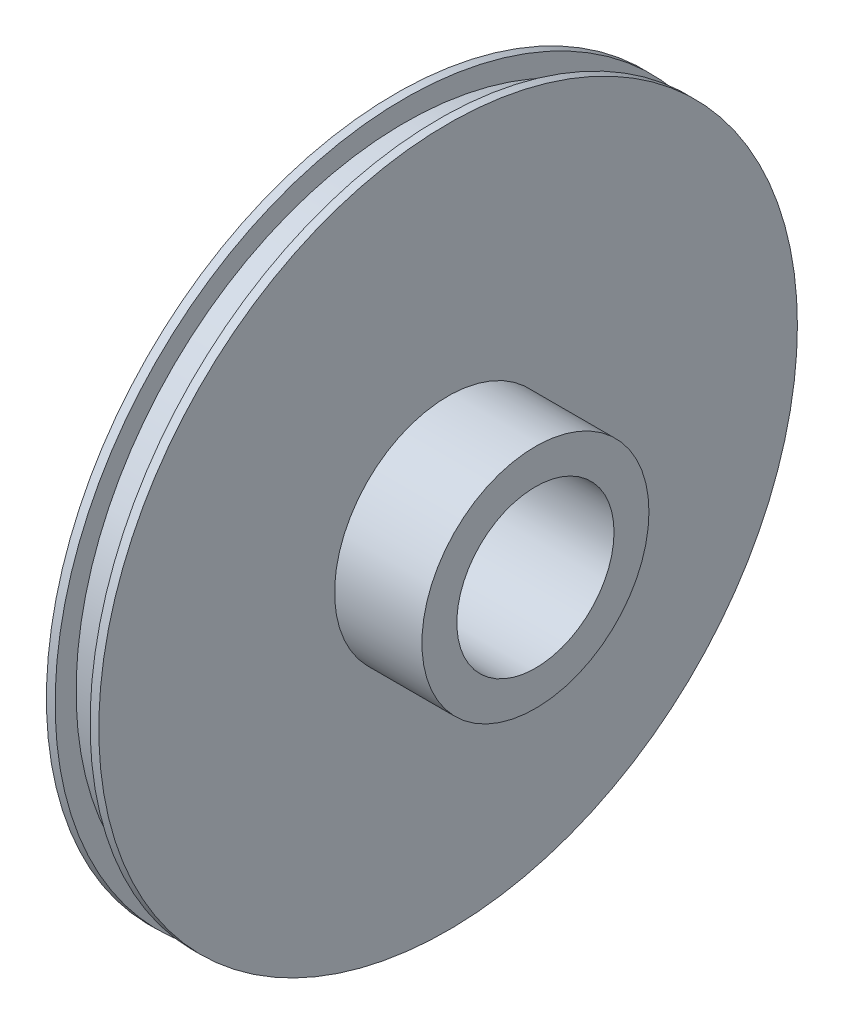
ISO-10303-21;
HEADER;
FILE_DESCRIPTION(('STEP AP214'),'2;1');
FILE_NAME('part.step','',(''),(''),'','','');
FILE_SCHEMA(('AUTOMOTIVE_DESIGN { 1 0 10303 214 1 1 1 1 }'));
ENDSEC;
DATA;
#1=APPLICATION_CONTEXT('core data for automotive mechanical design processes');
#2=APPLICATION_PROTOCOL_DEFINITION('international standard','automotive_design',2000,#1);
#3=PRODUCT_CONTEXT('',#1,'mechanical');
#4=PRODUCT('Part','Part','',(#3));
#5=PRODUCT_RELATED_PRODUCT_CATEGORY('part','',(#4));
#6=PRODUCT_DEFINITION_FORMATION('','',#4);
#7=PRODUCT_DEFINITION_CONTEXT('part definition',#1,'design');
#8=PRODUCT_DEFINITION('design','',#6,#7);
#9=PRODUCT_DEFINITION_SHAPE('','',#8);
#10=(LENGTH_UNIT() NAMED_UNIT(*) SI_UNIT(.MILLI.,.METRE.));
#11=(NAMED_UNIT(*) PLANE_ANGLE_UNIT() SI_UNIT($,.RADIAN.));
#12=(NAMED_UNIT(*) SI_UNIT($,.STERADIAN.) SOLID_ANGLE_UNIT());
#13=UNCERTAINTY_MEASURE_WITH_UNIT(LENGTH_MEASURE(1.E-05),#10,'distance_accuracy_value','');
#14=(GEOMETRIC_REPRESENTATION_CONTEXT(3) GLOBAL_UNCERTAINTY_ASSIGNED_CONTEXT((#13)) GLOBAL_UNIT_ASSIGNED_CONTEXT((#10,
#11,#12)) REPRESENTATION_CONTEXT('',''));
#15=CARTESIAN_POINT('',(0.,0.,0.));
#16=DIRECTION('',(0.,0.,1.));
#17=DIRECTION('',(1.,0.,0.));
#18=AXIS2_PLACEMENT_3D('',#15,#16,#17);
#19=CARTESIAN_POINT('',(-1.5,0.,0.));
#20=DIRECTION('',(1.,0.,0.));
#21=DIRECTION('',(0.,0.,-1.));
#22=AXIS2_PLACEMENT_3D('',#19,#20,#21);
#23=PLANE('',#22);
#24=CARTESIAN_POINT('',(-1.50000000000007,0.,0.));
#25=DIRECTION('',(-1.,0.,0.));
#26=DIRECTION('',(0.,0.,1.));
#27=AXIS2_PLACEMENT_3D('',#24,#25,#26);
#28=CIRCLE('',#27,15.4999999999999);
#29=CARTESIAN_POINT('',(-1.50000000000007,0.,15.4999999999999));
#30=VERTEX_POINT('',#29);
#31=EDGE_CURVE('E52',#30,#30,#28,.F.);
#32=ORIENTED_EDGE('',*,*,#31,.T.);
#33=EDGE_LOOP('',(#32));
#34=FACE_BOUND('',#33,.T.);
#35=CARTESIAN_POINT('',(-1.5,0.,0.));
#36=DIRECTION('',(1.,0.,0.));
#37=DIRECTION('',(0.,0.,-1.));
#38=AXIS2_PLACEMENT_3D('',#35,#36,#37);
#39=CIRCLE('',#38,20.);
#40=CARTESIAN_POINT('',(-1.5,0.,-20.));
#41=VERTEX_POINT('',#40);
#42=EDGE_CURVE('E18',#41,#41,#39,.T.);
#43=ORIENTED_EDGE('',*,*,#42,.F.);
#44=EDGE_LOOP('',(#43));
#45=FACE_BOUND('',#44,.T.);
#46=ADVANCED_FACE('F14',(#34,#45),#23,.F.);
#47=CARTESIAN_POINT('',(-1.9,0.,0.));
#48=DIRECTION('',(1.,0.,0.));
#49=DIRECTION('',(0.,0.,-1.));
#50=AXIS2_PLACEMENT_3D('',#47,#48,#49);
#51=CYLINDRICAL_SURFACE('',#50,20.);
#52=CARTESIAN_POINT('',(-1.,0.,0.));
#53=DIRECTION('',(1.,0.,0.));
#54=DIRECTION('',(0.,0.,-1.));
#55=AXIS2_PLACEMENT_3D('',#52,#53,#54);
#56=CIRCLE('',#55,20.);
#57=CARTESIAN_POINT('',(-1.,0.,-20.));
#58=VERTEX_POINT('',#57);
#59=EDGE_CURVE('E50',#58,#58,#56,.T.);
#60=ORIENTED_EDGE('',*,*,#59,.F.);
#61=EDGE_LOOP('',(#60));
#62=FACE_BOUND('',#61,.T.);
#63=ORIENTED_EDGE('',*,*,#42,.T.);
#64=EDGE_LOOP('',(#63));
#65=FACE_BOUND('',#64,.T.);
#66=ADVANCED_FACE('F59',(#62,#65),#51,.T.);
#67=CARTESIAN_POINT('',(-1.50000000000007,0.,0.));
#68=DIRECTION('',(-1.,0.,0.));
#69=DIRECTION('',(0.,0.,1.));
#70=AXIS2_PLACEMENT_3D('',#67,#68,#69);
#71=CONICAL_SURFACE('',#70,15.4999999999999,0.7853981633973);
#72=ORIENTED_EDGE('',*,*,#31,.F.);
#73=EDGE_LOOP('',(#72));
#74=FACE_BOUND('',#73,.T.);
#75=CARTESIAN_POINT('',(-0.499999999999928,0.,0.));
#76=DIRECTION('',(-1.,0.,0.));
#77=DIRECTION('',(0.,0.,1.));
#78=AXIS2_PLACEMENT_3D('',#75,#76,#77);
#79=CIRCLE('',#78,14.5000000000001);
#80=CARTESIAN_POINT('',(-0.499999999999928,0.,14.5000000000001));
#81=VERTEX_POINT('',#80);
#82=EDGE_CURVE('E47',#81,#81,#79,.F.);
#83=ORIENTED_EDGE('',*,*,#82,.T.);
#84=EDGE_LOOP('',(#83));
#85=FACE_BOUND('',#84,.T.);
#86=ADVANCED_FACE('F68',(#74,#85),#71,.F.);
#87=CARTESIAN_POINT('',(-1.,0.,0.));
#88=DIRECTION('',(1.,0.,0.));
#89=DIRECTION('',(0.,0.,-1.));
#90=AXIS2_PLACEMENT_3D('',#87,#88,#89);
#91=PLANE('',#90);
#92=CARTESIAN_POINT('',(-1.,0.,0.));
#93=DIRECTION('',(1.,0.,0.));
#94=DIRECTION('',(0.,0.,-1.));
#95=AXIS2_PLACEMENT_3D('',#92,#93,#94);
#96=CIRCLE('',#95,18.8);
#97=CARTESIAN_POINT('',(-1.,0.,-18.8));
#98=VERTEX_POINT('',#97);
#99=EDGE_CURVE('E44',#98,#98,#96,.T.);
#100=ORIENTED_EDGE('',*,*,#99,.F.);
#101=EDGE_LOOP('',(#100));
#102=FACE_BOUND('',#101,.T.);
#103=ORIENTED_EDGE('',*,*,#59,.T.);
#104=EDGE_LOOP('',(#103));
#105=FACE_BOUND('',#104,.T.);
#106=ADVANCED_FACE('F111',(#102,#105),#91,.T.);
#107=CARTESIAN_POINT('',(-0.5,0.,0.));
#108=DIRECTION('',(1.,0.,0.));
#109=DIRECTION('',(0.,0.,-1.));
#110=AXIS2_PLACEMENT_3D('',#107,#108,#109);
#111=PLANE('',#110);
#112=CARTESIAN_POINT('',(-0.5,0.,0.));
#113=DIRECTION('',(1.,0.,0.));
#114=DIRECTION('',(0.,0.,-1.));
#115=AXIS2_PLACEMENT_3D('',#112,#113,#114);
#116=CIRCLE('',#115,4.5);
#117=CARTESIAN_POINT('',(-0.5,0.,-4.5));
#118=VERTEX_POINT('',#117);
#119=EDGE_CURVE('E41',#118,#118,#116,.T.);
#120=ORIENTED_EDGE('',*,*,#119,.T.);
#121=EDGE_LOOP('',(#120));
#122=FACE_BOUND('',#121,.T.);
#123=ORIENTED_EDGE('',*,*,#82,.F.);
#124=EDGE_LOOP('',(#123));
#125=FACE_BOUND('',#124,.T.);
#126=ADVANCED_FACE('F107',(#122,#125),#111,.F.);
#127=CARTESIAN_POINT('',(-1.9,0.,0.));
#128=DIRECTION('',(1.,0.,0.));
#129=DIRECTION('',(0.,0.,-1.));
#130=AXIS2_PLACEMENT_3D('',#127,#128,#129);
#131=CYLINDRICAL_SURFACE('',#130,18.8);
#132=ORIENTED_EDGE('',*,*,#99,.T.);
#133=EDGE_LOOP('',(#132));
#134=FACE_BOUND('',#133,.T.);
#135=CARTESIAN_POINT('',(1.,0.,0.));
#136=DIRECTION('',(1.,0.,0.));
#137=DIRECTION('',(0.,0.,-1.));
#138=AXIS2_PLACEMENT_3D('',#135,#136,#137);
#139=CIRCLE('',#138,18.8);
#140=CARTESIAN_POINT('',(1.,0.,-18.8));
#141=VERTEX_POINT('',#140);
#142=EDGE_CURVE('E38',#141,#141,#139,.F.);
#143=ORIENTED_EDGE('',*,*,#142,.T.);
#144=EDGE_LOOP('',(#143));
#145=FACE_BOUND('',#144,.T.);
#146=ADVANCED_FACE('F100',(#134,#145),#131,.T.);
#147=CARTESIAN_POINT('',(-1.9,0.,0.));
#148=DIRECTION('',(1.,0.,0.));
#149=DIRECTION('',(0.,0.,-1.));
#150=AXIS2_PLACEMENT_3D('',#147,#148,#149);
#151=CYLINDRICAL_SURFACE('',#150,4.5);
#152=CARTESIAN_POINT('',(6.5,0.,0.));
#153=DIRECTION('',(1.,0.,0.));
#154=DIRECTION('',(0.,0.,-1.));
#155=AXIS2_PLACEMENT_3D('',#152,#153,#154);
#156=CIRCLE('',#155,4.5);
#157=CARTESIAN_POINT('',(6.5,0.,-4.5));
#158=VERTEX_POINT('',#157);
#159=EDGE_CURVE('E35',#158,#158,#156,.F.);
#160=ORIENTED_EDGE('',*,*,#159,.F.);
#161=EDGE_LOOP('',(#160));
#162=FACE_BOUND('',#161,.T.);
#163=ORIENTED_EDGE('',*,*,#119,.F.);
#164=EDGE_LOOP('',(#163));
#165=FACE_BOUND('',#164,.T.);
#166=ADVANCED_FACE('F90',(#162,#165),#151,.F.);
#167=CARTESIAN_POINT('',(1.,0.,0.));
#168=DIRECTION('',(1.,0.,0.));
#169=DIRECTION('',(0.,0.,-1.));
#170=AXIS2_PLACEMENT_3D('',#167,#168,#169);
#171=PLANE('',#170);
#172=ORIENTED_EDGE('',*,*,#142,.F.);
#173=EDGE_LOOP('',(#172));
#174=FACE_BOUND('',#173,.T.);
#175=CARTESIAN_POINT('',(1.,0.,0.));
#176=DIRECTION('',(1.,0.,0.));
#177=DIRECTION('',(0.,0.,-1.));
#178=AXIS2_PLACEMENT_3D('',#175,#176,#177);
#179=CIRCLE('',#178,20.);
#180=CARTESIAN_POINT('',(1.,0.,-20.));
#181=VERTEX_POINT('',#180);
#182=EDGE_CURVE('E32',#181,#181,#179,.T.);
#183=ORIENTED_EDGE('',*,*,#182,.F.);
#184=EDGE_LOOP('',(#183));
#185=FACE_BOUND('',#184,.T.);
#186=ADVANCED_FACE('F88',(#174,#185),#171,.F.);
#187=CARTESIAN_POINT('',(6.5,0.,0.));
#188=DIRECTION('',(1.,0.,0.));
#189=DIRECTION('',(0.,0.,-1.));
#190=AXIS2_PLACEMENT_3D('',#187,#188,#189);
#191=PLANE('',#190);
#192=ORIENTED_EDGE('',*,*,#159,.T.);
#193=EDGE_LOOP('',(#192));
#194=FACE_BOUND('',#193,.T.);
#195=CARTESIAN_POINT('',(6.5,0.,0.));
#196=DIRECTION('',(1.,0.,0.));
#197=DIRECTION('',(0.,0.,-1.));
#198=AXIS2_PLACEMENT_3D('',#195,#196,#197);
#199=CIRCLE('',#198,6.5);
#200=CARTESIAN_POINT('',(6.5,0.,-6.5));
#201=VERTEX_POINT('',#200);
#202=EDGE_CURVE('E27',#201,#201,#199,.F.);
#203=ORIENTED_EDGE('',*,*,#202,.F.);
#204=EDGE_LOOP('',(#203));
#205=FACE_BOUND('',#204,.T.);
#206=ADVANCED_FACE('F84',(#194,#205),#191,.T.);
#207=CARTESIAN_POINT('',(-1.9,0.,0.));
#208=DIRECTION('',(1.,0.,0.));
#209=DIRECTION('',(0.,0.,-1.));
#210=AXIS2_PLACEMENT_3D('',#207,#208,#209);
#211=CYLINDRICAL_SURFACE('',#210,20.);
#212=CARTESIAN_POINT('',(1.5,0.,0.));
#213=DIRECTION('',(1.,0.,0.));
#214=DIRECTION('',(0.,0.,-1.));
#215=AXIS2_PLACEMENT_3D('',#212,#213,#214);
#216=CIRCLE('',#215,20.);
#217=CARTESIAN_POINT('',(1.5,0.,-20.));
#218=VERTEX_POINT('',#217);
#219=EDGE_CURVE('E22',#218,#218,#216,.T.);
#220=ORIENTED_EDGE('',*,*,#219,.F.);
#221=EDGE_LOOP('',(#220));
#222=FACE_BOUND('',#221,.T.);
#223=ORIENTED_EDGE('',*,*,#182,.T.);
#224=EDGE_LOOP('',(#223));
#225=FACE_BOUND('',#224,.T.);
#226=ADVANCED_FACE('F77',(#222,#225),#211,.T.);
#227=CARTESIAN_POINT('',(-1.9,0.,0.));
#228=DIRECTION('',(1.,0.,0.));
#229=DIRECTION('',(0.,0.,-1.));
#230=AXIS2_PLACEMENT_3D('',#227,#228,#229);
#231=CYLINDRICAL_SURFACE('',#230,6.5);
#232=CARTESIAN_POINT('',(1.5,0.,0.));
#233=DIRECTION('',(1.,0.,0.));
#234=DIRECTION('',(0.,0.,-1.));
#235=AXIS2_PLACEMENT_3D('',#232,#233,#234);
#236=CIRCLE('',#235,6.5);
#237=CARTESIAN_POINT('',(1.5,0.,-6.5));
#238=VERTEX_POINT('',#237);
#239=EDGE_CURVE('E10',#238,#238,#236,.F.);
#240=ORIENTED_EDGE('',*,*,#239,.F.);
#241=EDGE_LOOP('',(#240));
#242=FACE_BOUND('',#241,.T.);
#243=ORIENTED_EDGE('',*,*,#202,.T.);
#244=EDGE_LOOP('',(#243));
#245=FACE_BOUND('',#244,.T.);
#246=ADVANCED_FACE('F72',(#242,#245),#231,.T.);
#247=CARTESIAN_POINT('',(1.5,0.,0.));
#248=DIRECTION('',(1.,0.,0.));
#249=DIRECTION('',(0.,0.,-1.));
#250=AXIS2_PLACEMENT_3D('',#247,#248,#249);
#251=PLANE('',#250);
#252=ORIENTED_EDGE('',*,*,#239,.T.);
#253=EDGE_LOOP('',(#252));
#254=FACE_BOUND('',#253,.T.);
#255=ORIENTED_EDGE('',*,*,#219,.T.);
#256=EDGE_LOOP('',(#255));
#257=FACE_BOUND('',#256,.T.);
#258=ADVANCED_FACE('F16',(#254,#257),#251,.T.);
#259=CLOSED_SHELL('',(#46,#66,#86,#106,#126,#146,#166,#186,#206,#226,#246,#258));
#260=MANIFOLD_SOLID_BREP('B1',#259);
#261=ADVANCED_BREP_SHAPE_REPRESENTATION('',(#18,#260),#14);
#262=SHAPE_DEFINITION_REPRESENTATION(#9,#261);
ENDSEC;
END-ISO-10303-21;
